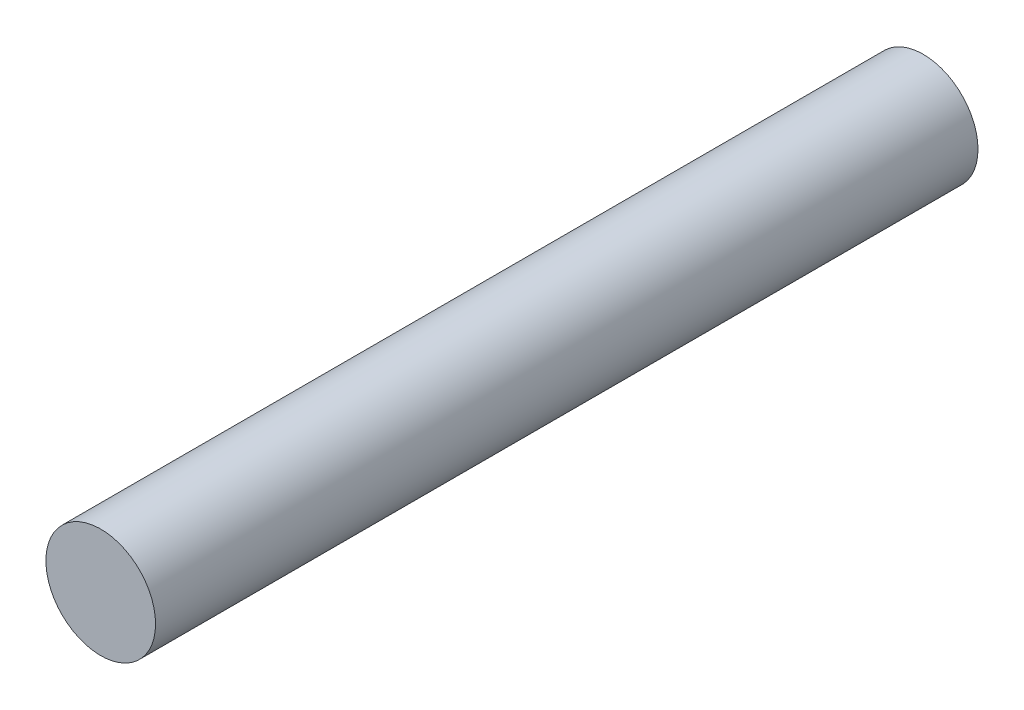
ISO-10303-21;
HEADER;
FILE_DESCRIPTION(('STEP AP214'),'2;1');
FILE_NAME('part.step','',(''),(''),'','','');
FILE_SCHEMA(('AUTOMOTIVE_DESIGN { 1 0 10303 214 1 1 1 1 }'));
ENDSEC;
DATA;
#1=APPLICATION_CONTEXT('core data for automotive mechanical design processes');
#2=APPLICATION_PROTOCOL_DEFINITION('international standard','automotive_design',2000,#1);
#3=PRODUCT_CONTEXT('',#1,'mechanical');
#4=PRODUCT('Part','Part','',(#3));
#5=PRODUCT_RELATED_PRODUCT_CATEGORY('part','',(#4));
#6=PRODUCT_DEFINITION_FORMATION('','',#4);
#7=PRODUCT_DEFINITION_CONTEXT('part definition',#1,'design');
#8=PRODUCT_DEFINITION('design','',#6,#7);
#9=PRODUCT_DEFINITION_SHAPE('','',#8);
#10=(LENGTH_UNIT() NAMED_UNIT(*) SI_UNIT(.MILLI.,.METRE.));
#11=(NAMED_UNIT(*) PLANE_ANGLE_UNIT() SI_UNIT($,.RADIAN.));
#12=(NAMED_UNIT(*) SI_UNIT($,.STERADIAN.) SOLID_ANGLE_UNIT());
#13=UNCERTAINTY_MEASURE_WITH_UNIT(LENGTH_MEASURE(1.E-05),#10,'distance_accuracy_value','');
#14=(GEOMETRIC_REPRESENTATION_CONTEXT(3) GLOBAL_UNCERTAINTY_ASSIGNED_CONTEXT((#13)) GLOBAL_UNIT_ASSIGNED_CONTEXT((#10,
#11,#12)) REPRESENTATION_CONTEXT('',''));
#15=CARTESIAN_POINT('',(0.,0.,0.));
#16=DIRECTION('',(0.,0.,1.));
#17=DIRECTION('',(1.,0.,0.));
#18=AXIS2_PLACEMENT_3D('',#15,#16,#17);
#19=CARTESIAN_POINT('',(0.,0.,150.));
#20=DIRECTION('',(0.,0.,-1.));
#21=DIRECTION('',(-1.,0.,0.));
#22=AXIS2_PLACEMENT_3D('',#19,#20,#21);
#23=CYLINDRICAL_SURFACE('',#22,10.);
#24=CARTESIAN_POINT('',(0.,0.,150.));
#25=DIRECTION('',(0.,0.,1.));
#26=DIRECTION('',(1.,0.,0.));
#27=AXIS2_PLACEMENT_3D('',#24,#25,#26);
#28=CIRCLE('',#27,10.);
#29=CARTESIAN_POINT('',(10.,0.,150.));
#30=VERTEX_POINT('',#29);
#31=EDGE_CURVE('E10',#30,#30,#28,.T.);
#32=ORIENTED_EDGE('',*,*,#31,.F.);
#33=EDGE_LOOP('',(#32));
#34=FACE_BOUND('',#33,.T.);
#35=CARTESIAN_POINT('',(0.,0.,0.));
#36=DIRECTION('',(0.,0.,1.));
#37=DIRECTION('',(1.,0.,0.));
#38=AXIS2_PLACEMENT_3D('',#35,#36,#37);
#39=CIRCLE('',#38,10.);
#40=CARTESIAN_POINT('',(10.,0.,0.));
#41=VERTEX_POINT('',#40);
#42=EDGE_CURVE('E40',#41,#41,#39,.T.);
#43=ORIENTED_EDGE('',*,*,#42,.T.);
#44=EDGE_LOOP('',(#43));
#45=FACE_BOUND('',#44,.T.);
#46=ADVANCED_FACE('F37',(#34,#45),#23,.T.);
#47=CARTESIAN_POINT('',(0.,0.,150.));
#48=DIRECTION('',(0.,0.,1.));
#49=DIRECTION('',(1.,0.,0.));
#50=AXIS2_PLACEMENT_3D('',#47,#48,#49);
#51=PLANE('',#50);
#52=ORIENTED_EDGE('',*,*,#31,.T.);
#53=EDGE_LOOP('',(#52));
#54=FACE_BOUND('',#53,.T.);
#55=ADVANCED_FACE('F54',(#54),#51,.T.);
#56=CARTESIAN_POINT('',(0.,0.,0.));
#57=DIRECTION('',(0.,0.,1.));
#58=DIRECTION('',(1.,0.,0.));
#59=AXIS2_PLACEMENT_3D('',#56,#57,#58);
#60=PLANE('',#59);
#61=ORIENTED_EDGE('',*,*,#42,.F.);
#62=EDGE_LOOP('',(#61));
#63=FACE_BOUND('',#62,.T.);
#64=ADVANCED_FACE('F52',(#63),#60,.F.);
#65=CLOSED_SHELL('',(#46,#55,#64));
#66=MANIFOLD_SOLID_BREP('B2',#65);
#67=ADVANCED_BREP_SHAPE_REPRESENTATION('',(#18,#66),#14);
#68=SHAPE_DEFINITION_REPRESENTATION(#9,#67);
ENDSEC;
END-ISO-10303-21;
